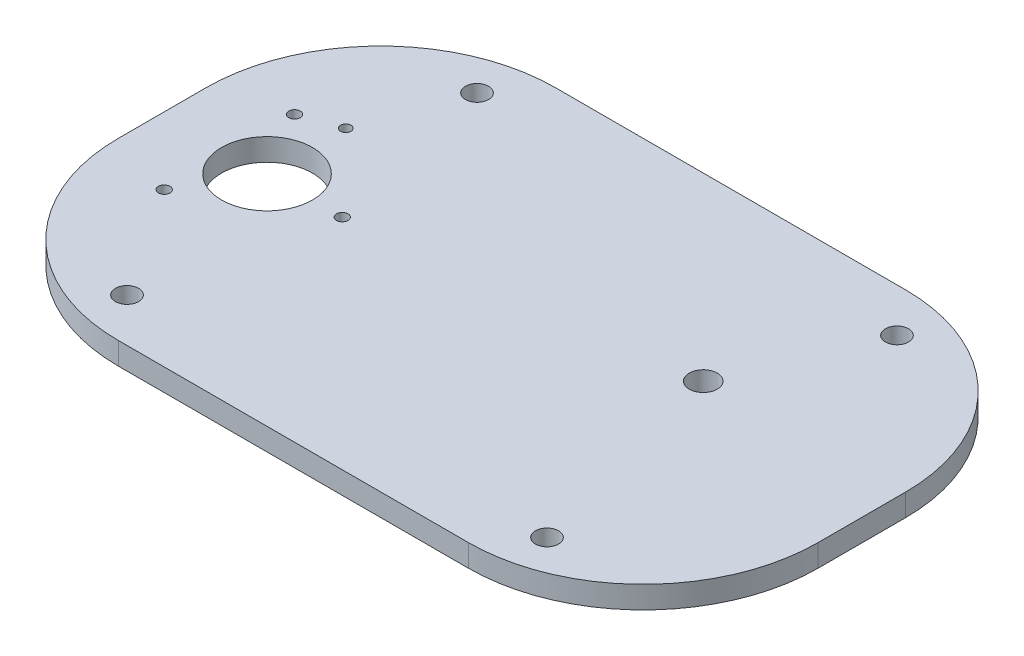
ISO-10303-21;
HEADER;
FILE_DESCRIPTION(('STEP AP214'),'2;1');
FILE_NAME('part.step','',(''),(''),'','','');
FILE_SCHEMA(('AUTOMOTIVE_DESIGN { 1 0 10303 214 1 1 1 1 }'));
ENDSEC;
DATA;
#1=APPLICATION_CONTEXT('core data for automotive mechanical design processes');
#2=APPLICATION_PROTOCOL_DEFINITION('international standard','automotive_design',2000,#1);
#3=PRODUCT_CONTEXT('',#1,'mechanical');
#4=PRODUCT('Part','Part','',(#3));
#5=PRODUCT_RELATED_PRODUCT_CATEGORY('part','',(#4));
#6=PRODUCT_DEFINITION_FORMATION('','',#4);
#7=PRODUCT_DEFINITION_CONTEXT('part definition',#1,'design');
#8=PRODUCT_DEFINITION('design','',#6,#7);
#9=PRODUCT_DEFINITION_SHAPE('','',#8);
#10=(LENGTH_UNIT() NAMED_UNIT(*) SI_UNIT(.MILLI.,.METRE.));
#11=(NAMED_UNIT(*) PLANE_ANGLE_UNIT() SI_UNIT($,.RADIAN.));
#12=(NAMED_UNIT(*) SI_UNIT($,.STERADIAN.) SOLID_ANGLE_UNIT());
#13=UNCERTAINTY_MEASURE_WITH_UNIT(LENGTH_MEASURE(1.E-05),#10,'distance_accuracy_value','');
#14=(GEOMETRIC_REPRESENTATION_CONTEXT(3) GLOBAL_UNCERTAINTY_ASSIGNED_CONTEXT((#13)) GLOBAL_UNIT_ASSIGNED_CONTEXT((#10,
#11,#12)) REPRESENTATION_CONTEXT('',''));
#15=CARTESIAN_POINT('',(0.,0.,0.));
#16=DIRECTION('',(0.,0.,1.));
#17=DIRECTION('',(1.,0.,0.));
#18=AXIS2_PLACEMENT_3D('',#15,#16,#17);
#19=CARTESIAN_POINT('',(0.,6.35,62.5));
#20=DIRECTION('',(0.,0.,-1.));
#21=DIRECTION('',(-1.,0.,0.));
#22=AXIS2_PLACEMENT_3D('',#19,#20,#21);
#23=PLANE('',#22);
#24=DIRECTION('',(1.,0.,0.));
#25=VECTOR('',#24,1.);
#26=CARTESIAN_POINT('',(0.,0.,62.5));
#27=LINE('',#26,#25);
#28=CARTESIAN_POINT('',(-50.,0.,62.5));
#29=VERTEX_POINT('',#28);
#30=CARTESIAN_POINT('',(50.,0.,62.5));
#31=VERTEX_POINT('',#30);
#32=EDGE_CURVE('E143',#29,#31,#27,.T.);
#33=ORIENTED_EDGE('',*,*,#32,.T.);
#34=DIRECTION('',(0.,-1.,0.));
#35=VECTOR('',#34,1.);
#36=CARTESIAN_POINT('',(50.,6.35,62.5));
#37=LINE('',#36,#35);
#38=CARTESIAN_POINT('',(50.,6.35,62.5));
#39=VERTEX_POINT('',#38);
#40=EDGE_CURVE('E117',#31,#39,#37,.F.);
#41=ORIENTED_EDGE('',*,*,#40,.T.);
#42=DIRECTION('',(1.,0.,0.));
#43=VECTOR('',#42,1.);
#44=CARTESIAN_POINT('',(0.,6.35,62.5));
#45=LINE('',#44,#43);
#46=CARTESIAN_POINT('',(-50.,6.35,62.5));
#47=VERTEX_POINT('',#46);
#48=EDGE_CURVE('E180',#47,#39,#45,.T.);
#49=ORIENTED_EDGE('',*,*,#48,.F.);
#50=DIRECTION('',(0.,-1.,0.));
#51=VECTOR('',#50,1.);
#52=CARTESIAN_POINT('',(-50.,0.,62.5));
#53=LINE('',#52,#51);
#54=EDGE_CURVE('E123',#47,#29,#53,.T.);
#55=ORIENTED_EDGE('',*,*,#54,.T.);
#56=EDGE_LOOP('',(#33,#41,#49,#55));
#57=FACE_BOUND('',#56,.T.);
#58=ADVANCED_FACE('F45',(#57),#23,.F.);
#59=CARTESIAN_POINT('',(100.,6.35,0.));
#60=DIRECTION('',(-1.,0.,0.));
#61=DIRECTION('',(0.,0.,1.));
#62=AXIS2_PLACEMENT_3D('',#59,#60,#61);
#63=PLANE('',#62);
#64=DIRECTION('',(0.,0.,-1.));
#65=VECTOR('',#64,1.);
#66=CARTESIAN_POINT('',(100.,6.35,0.));
#67=LINE('',#66,#65);
#68=CARTESIAN_POINT('',(100.,6.35,12.5));
#69=VERTEX_POINT('',#68);
#70=CARTESIAN_POINT('',(100.,6.35,-12.5));
#71=VERTEX_POINT('',#70);
#72=EDGE_CURVE('E133',#69,#71,#67,.T.);
#73=ORIENTED_EDGE('',*,*,#72,.F.);
#74=DIRECTION('',(0.,-1.,0.));
#75=VECTOR('',#74,1.);
#76=CARTESIAN_POINT('',(100.,6.35,12.5));
#77=LINE('',#76,#75);
#78=CARTESIAN_POINT('',(100.,0.,12.5));
#79=VERTEX_POINT('',#78);
#80=EDGE_CURVE('E116',#69,#79,#77,.T.);
#81=ORIENTED_EDGE('',*,*,#80,.T.);
#82=DIRECTION('',(0.,0.,-1.));
#83=VECTOR('',#82,1.);
#84=CARTESIAN_POINT('',(100.,0.,0.));
#85=LINE('',#84,#83);
#86=CARTESIAN_POINT('',(100.,0.,-12.5));
#87=VERTEX_POINT('',#86);
#88=EDGE_CURVE('E130',#79,#87,#85,.T.);
#89=ORIENTED_EDGE('',*,*,#88,.T.);
#90=DIRECTION('',(0.,-1.,0.));
#91=VECTOR('',#90,1.);
#92=CARTESIAN_POINT('',(100.,6.35,-12.5));
#93=LINE('',#92,#91);
#94=EDGE_CURVE('E136',#87,#71,#93,.F.);
#95=ORIENTED_EDGE('',*,*,#94,.T.);
#96=EDGE_LOOP('',(#73,#81,#89,#95));
#97=FACE_BOUND('',#96,.T.);
#98=ADVANCED_FACE('F129',(#97),#63,.F.);
#99=CARTESIAN_POINT('',(0.,6.35,-62.5));
#100=DIRECTION('',(0.,0.,-1.));
#101=DIRECTION('',(-1.,0.,0.));
#102=AXIS2_PLACEMENT_3D('',#99,#100,#101);
#103=PLANE('',#102);
#104=DIRECTION('',(1.,0.,0.));
#105=VECTOR('',#104,1.);
#106=CARTESIAN_POINT('',(0.,6.35,-62.5));
#107=LINE('',#106,#105);
#108=CARTESIAN_POINT('',(-50.,6.35,-62.5));
#109=VERTEX_POINT('',#108);
#110=CARTESIAN_POINT('',(50.,6.35,-62.5));
#111=VERTEX_POINT('',#110);
#112=EDGE_CURVE('E239',#109,#111,#107,.T.);
#113=ORIENTED_EDGE('',*,*,#112,.T.);
#114=DIRECTION('',(0.,-1.,0.));
#115=VECTOR('',#114,1.);
#116=CARTESIAN_POINT('',(50.,0.,-62.5));
#117=LINE('',#116,#115);
#118=CARTESIAN_POINT('',(50.,0.,-62.5));
#119=VERTEX_POINT('',#118);
#120=EDGE_CURVE('E210',#111,#119,#117,.T.);
#121=ORIENTED_EDGE('',*,*,#120,.T.);
#122=DIRECTION('',(1.,0.,0.));
#123=VECTOR('',#122,1.);
#124=CARTESIAN_POINT('',(0.,0.,-62.5));
#125=LINE('',#124,#123);
#126=CARTESIAN_POINT('',(-50.,0.,-62.5));
#127=VERTEX_POINT('',#126);
#128=EDGE_CURVE('E142',#127,#119,#125,.T.);
#129=ORIENTED_EDGE('',*,*,#128,.F.);
#130=DIRECTION('',(0.,-1.,0.));
#131=VECTOR('',#130,1.);
#132=CARTESIAN_POINT('',(-50.,6.35,-62.5));
#133=LINE('',#132,#131);
#134=EDGE_CURVE('E207',#127,#109,#133,.F.);
#135=ORIENTED_EDGE('',*,*,#134,.T.);
#136=EDGE_LOOP('',(#113,#121,#129,#135));
#137=FACE_BOUND('',#136,.T.);
#138=ADVANCED_FACE('F329',(#137),#103,.T.);
#139=CARTESIAN_POINT('',(-70.,6.35,-22.5000000000003));
#140=DIRECTION('',(0.,-1.,0.));
#141=DIRECTION('',(0.,0.,-1.));
#142=AXIS2_PLACEMENT_3D('',#139,#140,#141);
#143=CYLINDRICAL_SURFACE('',#142,1.5);
#144=CARTESIAN_POINT('',(-70.,6.35,-22.5000000000003));
#145=DIRECTION('',(0.,1.,0.));
#146=DIRECTION('',(0.,0.,1.));
#147=AXIS2_PLACEMENT_3D('',#144,#145,#146);
#148=CIRCLE('',#147,1.5);
#149=CARTESIAN_POINT('',(-70.,6.35,-21.0000000000003));
#150=VERTEX_POINT('',#149);
#151=EDGE_CURVE('E217',#150,#150,#148,.T.);
#152=ORIENTED_EDGE('',*,*,#151,.T.);
#153=EDGE_LOOP('',(#152));
#154=FACE_BOUND('',#153,.T.);
#155=CARTESIAN_POINT('',(-70.,0.,-22.5000000000003));
#156=DIRECTION('',(0.,1.,0.));
#157=DIRECTION('',(0.,0.,1.));
#158=AXIS2_PLACEMENT_3D('',#155,#156,#157);
#159=CIRCLE('',#158,1.5);
#160=CARTESIAN_POINT('',(-70.,0.,-21.0000000000003));
#161=VERTEX_POINT('',#160);
#162=EDGE_CURVE('E172',#161,#161,#159,.T.);
#163=ORIENTED_EDGE('',*,*,#162,.F.);
#164=EDGE_LOOP('',(#163));
#165=FACE_BOUND('',#164,.T.);
#166=ADVANCED_FACE('F352',(#154,#165),#143,.F.);
#167=CARTESIAN_POINT('',(-80.7500000000001,6.35,18.6195461813697));
#168=DIRECTION('',(0.,-1.,0.));
#169=DIRECTION('',(0.,0.,-1.));
#170=AXIS2_PLACEMENT_3D('',#167,#168,#169);
#171=CYLINDRICAL_SURFACE('',#170,1.65000000000059);
#172=CARTESIAN_POINT('',(-80.7500000000001,6.35,18.6195461813697));
#173=DIRECTION('',(0.,1.,0.));
#174=DIRECTION('',(0.,0.,1.));
#175=AXIS2_PLACEMENT_3D('',#172,#173,#174);
#176=CIRCLE('',#175,1.65000000000059);
#177=CARTESIAN_POINT('',(-80.7500000000001,6.35,20.2695461813703));
#178=VERTEX_POINT('',#177);
#179=EDGE_CURVE('E220',#178,#178,#176,.T.);
#180=ORIENTED_EDGE('',*,*,#179,.T.);
#181=EDGE_LOOP('',(#180));
#182=FACE_BOUND('',#181,.T.);
#183=CARTESIAN_POINT('',(-80.7500000000001,0.,18.6195461813697));
#184=DIRECTION('',(0.,1.,0.));
#185=DIRECTION('',(0.,0.,1.));
#186=AXIS2_PLACEMENT_3D('',#183,#184,#185);
#187=CIRCLE('',#186,1.65000000000059);
#188=CARTESIAN_POINT('',(-80.7500000000001,0.,20.2695461813703));
#189=VERTEX_POINT('',#188);
#190=EDGE_CURVE('E168',#189,#189,#187,.T.);
#191=ORIENTED_EDGE('',*,*,#190,.F.);
#192=EDGE_LOOP('',(#191));
#193=FACE_BOUND('',#192,.T.);
#194=ADVANCED_FACE('F356',(#182,#193),#171,.F.);
#195=CARTESIAN_POINT('',(-80.75,6.35,-18.6195461813703));
#196=DIRECTION('',(0.,-1.,0.));
#197=DIRECTION('',(0.,0.,-1.));
#198=AXIS2_PLACEMENT_3D('',#195,#196,#197);
#199=CYLINDRICAL_SURFACE('',#198,1.65000000000059);
#200=CARTESIAN_POINT('',(-80.75,6.35,-18.6195461813703));
#201=DIRECTION('',(0.,1.,0.));
#202=DIRECTION('',(0.,0.,1.));
#203=AXIS2_PLACEMENT_3D('',#200,#201,#202);
#204=CIRCLE('',#203,1.65000000000059);
#205=CARTESIAN_POINT('',(-80.75,6.35,-16.9695461813697));
#206=VERTEX_POINT('',#205);
#207=EDGE_CURVE('E224',#206,#206,#204,.T.);
#208=ORIENTED_EDGE('',*,*,#207,.T.);
#209=EDGE_LOOP('',(#208));
#210=FACE_BOUND('',#209,.T.);
#211=CARTESIAN_POINT('',(-80.75,0.,-18.6195461813703));
#212=DIRECTION('',(0.,1.,0.));
#213=DIRECTION('',(0.,0.,1.));
#214=AXIS2_PLACEMENT_3D('',#211,#212,#213);
#215=CIRCLE('',#214,1.65000000000059);
#216=CARTESIAN_POINT('',(-80.75,0.,-16.9695461813697));
#217=VERTEX_POINT('',#216);
#218=EDGE_CURVE('E164',#217,#217,#215,.T.);
#219=ORIENTED_EDGE('',*,*,#218,.F.);
#220=EDGE_LOOP('',(#219));
#221=FACE_BOUND('',#220,.T.);
#222=ADVANCED_FACE('F369',(#210,#221),#199,.F.);
#223=CARTESIAN_POINT('',(-48.5000000000001,6.35,-2.33343359525923E-13));
#224=DIRECTION('',(0.,-1.,0.));
#225=DIRECTION('',(0.,0.,-1.));
#226=AXIS2_PLACEMENT_3D('',#223,#224,#225);
#227=CYLINDRICAL_SURFACE('',#226,1.65000000000001);
#228=CARTESIAN_POINT('',(-48.5000000000001,6.35,-2.33343359525923E-13));
#229=DIRECTION('',(0.,1.,0.));
#230=DIRECTION('',(0.,0.,1.));
#231=AXIS2_PLACEMENT_3D('',#228,#229,#230);
#232=CIRCLE('',#231,1.65000000000001);
#233=CARTESIAN_POINT('',(-48.5000000000001,6.35,1.64999999999977));
#234=VERTEX_POINT('',#233);
#235=EDGE_CURVE('E228',#234,#234,#232,.T.);
#236=ORIENTED_EDGE('',*,*,#235,.T.);
#237=EDGE_LOOP('',(#236));
#238=FACE_BOUND('',#237,.T.);
#239=CARTESIAN_POINT('',(-48.5000000000001,0.,-2.33343359525923E-13));
#240=DIRECTION('',(0.,1.,0.));
#241=DIRECTION('',(0.,0.,1.));
#242=AXIS2_PLACEMENT_3D('',#239,#240,#241);
#243=CIRCLE('',#242,1.65000000000001);
#244=CARTESIAN_POINT('',(-48.5000000000001,0.,1.64999999999977));
#245=VERTEX_POINT('',#244);
#246=EDGE_CURVE('E160',#245,#245,#243,.T.);
#247=ORIENTED_EDGE('',*,*,#246,.F.);
#248=EDGE_LOOP('',(#247));
#249=FACE_BOUND('',#248,.T.);
#250=ADVANCED_FACE('F365',(#238,#249),#227,.F.);
#251=CARTESIAN_POINT('',(-70.0000000000001,6.35,-2.58406644306836E-13));
#252=DIRECTION('',(0.,-1.,0.));
#253=DIRECTION('',(0.,0.,-1.));
#254=AXIS2_PLACEMENT_3D('',#251,#252,#253);
#255=CYLINDRICAL_SURFACE('',#254,13.);
#256=CARTESIAN_POINT('',(-70.0000000000001,6.35,-2.58406644306836E-13));
#257=DIRECTION('',(0.,1.,0.));
#258=DIRECTION('',(0.,0.,1.));
#259=AXIS2_PLACEMENT_3D('',#256,#257,#258);
#260=CIRCLE('',#259,13.);
#261=CARTESIAN_POINT('',(-70.0000000000001,6.35,12.9999999999997));
#262=VERTEX_POINT('',#261);
#263=EDGE_CURVE('E232',#262,#262,#260,.T.);
#264=ORIENTED_EDGE('',*,*,#263,.T.);
#265=EDGE_LOOP('',(#264));
#266=FACE_BOUND('',#265,.T.);
#267=CARTESIAN_POINT('',(-70.0000000000001,0.,-2.58406644306836E-13));
#268=DIRECTION('',(0.,1.,0.));
#269=DIRECTION('',(0.,0.,1.));
#270=AXIS2_PLACEMENT_3D('',#267,#268,#269);
#271=CIRCLE('',#270,13.);
#272=CARTESIAN_POINT('',(-70.0000000000001,0.,12.9999999999997));
#273=VERTEX_POINT('',#272);
#274=EDGE_CURVE('E156',#273,#273,#271,.T.);
#275=ORIENTED_EDGE('',*,*,#274,.F.);
#276=EDGE_LOOP('',(#275));
#277=FACE_BOUND('',#276,.T.);
#278=ADVANCED_FACE('F362',(#266,#277),#255,.F.);
#279=CARTESIAN_POINT('',(-100.,6.35,0.));
#280=DIRECTION('',(-1.,0.,0.));
#281=DIRECTION('',(0.,0.,1.));
#282=AXIS2_PLACEMENT_3D('',#279,#280,#281);
#283=PLANE('',#282);
#284=DIRECTION('',(0.,0.,-1.));
#285=VECTOR('',#284,1.);
#286=CARTESIAN_POINT('',(-100.,6.35,0.));
#287=LINE('',#286,#285);
#288=CARTESIAN_POINT('',(-100.,6.35,12.5));
#289=VERTEX_POINT('',#288);
#290=CARTESIAN_POINT('',(-100.,6.35,-12.5));
#291=VERTEX_POINT('',#290);
#292=EDGE_CURVE('E236',#289,#291,#287,.T.);
#293=ORIENTED_EDGE('',*,*,#292,.T.);
#294=DIRECTION('',(0.,-1.,0.));
#295=VECTOR('',#294,1.);
#296=CARTESIAN_POINT('',(-100.,6.35,-12.5));
#297=LINE('',#296,#295);
#298=CARTESIAN_POINT('',(-100.,0.,-12.5));
#299=VERTEX_POINT('',#298);
#300=EDGE_CURVE('E11',#291,#299,#297,.T.);
#301=ORIENTED_EDGE('',*,*,#300,.T.);
#302=DIRECTION('',(0.,0.,-1.));
#303=VECTOR('',#302,1.);
#304=CARTESIAN_POINT('',(-100.,0.,0.));
#305=LINE('',#304,#303);
#306=CARTESIAN_POINT('',(-100.,0.,12.5));
#307=VERTEX_POINT('',#306);
#308=EDGE_CURVE('E147',#307,#299,#305,.T.);
#309=ORIENTED_EDGE('',*,*,#308,.F.);
#310=DIRECTION('',(0.,-1.,0.));
#311=VECTOR('',#310,1.);
#312=CARTESIAN_POINT('',(-100.,6.35,12.5));
#313=LINE('',#312,#311);
#314=EDGE_CURVE('E54',#307,#289,#313,.F.);
#315=ORIENTED_EDGE('',*,*,#314,.T.);
#316=EDGE_LOOP('',(#293,#301,#309,#315));
#317=FACE_BOUND('',#316,.T.);
#318=ADVANCED_FACE('F310',(#317),#283,.T.);
#319=CARTESIAN_POINT('',(43.6438763198442,6.35,-11.0000000000004));
#320=DIRECTION('',(0.,-1.,0.));
#321=DIRECTION('',(0.,0.,-1.));
#322=AXIS2_PLACEMENT_3D('',#319,#320,#321);
#323=CYLINDRICAL_SURFACE('',#322,4.00000000000003);
#324=CARTESIAN_POINT('',(43.6438763198442,6.35,-11.0000000000004));
#325=DIRECTION('',(0.,1.,0.));
#326=DIRECTION('',(0.,0.,1.));
#327=AXIS2_PLACEMENT_3D('',#324,#325,#326);
#328=CIRCLE('',#327,4.00000000000003);
#329=CARTESIAN_POINT('',(43.6438763198442,6.35,-7.00000000000041));
#330=VERTEX_POINT('',#329);
#331=EDGE_CURVE('E182',#330,#330,#328,.T.);
#332=ORIENTED_EDGE('',*,*,#331,.T.);
#333=EDGE_LOOP('',(#332));
#334=FACE_BOUND('',#333,.T.);
#335=CARTESIAN_POINT('',(43.6438763198442,0.,-11.0000000000004));
#336=DIRECTION('',(0.,1.,0.));
#337=DIRECTION('',(0.,0.,1.));
#338=AXIS2_PLACEMENT_3D('',#335,#336,#337);
#339=CIRCLE('',#338,4.00000000000003);
#340=CARTESIAN_POINT('',(43.6438763198442,0.,-7.00000000000041));
#341=VERTEX_POINT('',#340);
#342=EDGE_CURVE('E176',#341,#341,#339,.T.);
#343=ORIENTED_EDGE('',*,*,#342,.F.);
#344=EDGE_LOOP('',(#343));
#345=FACE_BOUND('',#344,.T.);
#346=ADVANCED_FACE('F288',(#334,#345),#323,.F.);
#347=CARTESIAN_POINT('',(0.,6.35,0.));
#348=DIRECTION('',(0.,1.,0.));
#349=DIRECTION('',(0.,0.,1.));
#350=AXIS2_PLACEMENT_3D('',#347,#348,#349);
#351=PLANE('',#350);
#352=CARTESIAN_POINT('',(60.,6.35,-50.));
#353=DIRECTION('',(0.,1.,0.));
#354=DIRECTION('',(0.,0.,1.));
#355=AXIS2_PLACEMENT_3D('',#352,#353,#354);
#356=CIRCLE('',#355,3.3);
#357=CARTESIAN_POINT('',(60.,6.35,-46.7));
#358=VERTEX_POINT('',#357);
#359=EDGE_CURVE('E277',#358,#358,#356,.T.);
#360=ORIENTED_EDGE('',*,*,#359,.F.);
#361=EDGE_LOOP('',(#360));
#362=FACE_BOUND('',#361,.T.);
#363=CARTESIAN_POINT('',(-60.,6.35,50.));
#364=DIRECTION('',(0.,1.,0.));
#365=DIRECTION('',(0.,0.,1.));
#366=AXIS2_PLACEMENT_3D('',#363,#364,#365);
#367=CIRCLE('',#366,3.3);
#368=CARTESIAN_POINT('',(-60.,6.35,53.3));
#369=VERTEX_POINT('',#368);
#370=EDGE_CURVE('E269',#369,#369,#367,.T.);
#371=ORIENTED_EDGE('',*,*,#370,.F.);
#372=EDGE_LOOP('',(#371));
#373=FACE_BOUND('',#372,.T.);
#374=CARTESIAN_POINT('',(-60.,6.35,-50.));
#375=DIRECTION('',(0.,1.,0.));
#376=DIRECTION('',(0.,0.,1.));
#377=AXIS2_PLACEMENT_3D('',#374,#375,#376);
#378=CIRCLE('',#377,3.3);
#379=CARTESIAN_POINT('',(-60.,6.35,-46.7));
#380=VERTEX_POINT('',#379);
#381=EDGE_CURVE('E261',#380,#380,#378,.T.);
#382=ORIENTED_EDGE('',*,*,#381,.F.);
#383=EDGE_LOOP('',(#382));
#384=FACE_BOUND('',#383,.T.);
#385=CARTESIAN_POINT('',(60.,6.35,50.));
#386=DIRECTION('',(0.,1.,0.));
#387=DIRECTION('',(0.,0.,1.));
#388=AXIS2_PLACEMENT_3D('',#385,#386,#387);
#389=CIRCLE('',#388,3.3);
#390=CARTESIAN_POINT('',(60.,6.35,53.3));
#391=VERTEX_POINT('',#390);
#392=EDGE_CURVE('E253',#391,#391,#389,.T.);
#393=ORIENTED_EDGE('',*,*,#392,.F.);
#394=EDGE_LOOP('',(#393));
#395=FACE_BOUND('',#394,.T.);
#396=ORIENTED_EDGE('',*,*,#48,.T.);
#397=CARTESIAN_POINT('',(50.,6.35,12.5));
#398=DIRECTION('',(0.,1.,0.));
#399=DIRECTION('',(0.,0.,1.));
#400=AXIS2_PLACEMENT_3D('',#397,#398,#399);
#401=CIRCLE('',#400,50.);
#402=EDGE_CURVE('E204',#39,#69,#401,.T.);
#403=ORIENTED_EDGE('',*,*,#402,.T.);
#404=ORIENTED_EDGE('',*,*,#72,.T.);
#405=CARTESIAN_POINT('',(50.,6.35,-12.5));
#406=DIRECTION('',(0.,1.,0.));
#407=DIRECTION('',(0.,0.,1.));
#408=AXIS2_PLACEMENT_3D('',#405,#406,#407);
#409=CIRCLE('',#408,50.);
#410=EDGE_CURVE('E201',#71,#111,#409,.T.);
#411=ORIENTED_EDGE('',*,*,#410,.T.);
#412=ORIENTED_EDGE('',*,*,#112,.F.);
#413=CARTESIAN_POINT('',(-50.,6.35,-12.5));
#414=DIRECTION('',(0.,1.,0.));
#415=DIRECTION('',(0.,0.,1.));
#416=AXIS2_PLACEMENT_3D('',#413,#414,#415);
#417=CIRCLE('',#416,50.);
#418=EDGE_CURVE('E61',#109,#291,#417,.T.);
#419=ORIENTED_EDGE('',*,*,#418,.T.);
#420=ORIENTED_EDGE('',*,*,#292,.F.);
#421=CARTESIAN_POINT('',(-50.,6.35,12.5));
#422=DIRECTION('',(0.,1.,0.));
#423=DIRECTION('',(0.,0.,1.));
#424=AXIS2_PLACEMENT_3D('',#421,#422,#423);
#425=CIRCLE('',#424,50.);
#426=EDGE_CURVE('E196',#289,#47,#425,.T.);
#427=ORIENTED_EDGE('',*,*,#426,.T.);
#428=EDGE_LOOP('',(#396,#403,#404,#411,#412,#419,#420,#427));
#429=FACE_BOUND('',#428,.T.);
#430=ORIENTED_EDGE('',*,*,#263,.F.);
#431=EDGE_LOOP('',(#430));
#432=FACE_BOUND('',#431,.T.);
#433=ORIENTED_EDGE('',*,*,#235,.F.);
#434=EDGE_LOOP('',(#433));
#435=FACE_BOUND('',#434,.T.);
#436=ORIENTED_EDGE('',*,*,#207,.F.);
#437=EDGE_LOOP('',(#436));
#438=FACE_BOUND('',#437,.T.);
#439=ORIENTED_EDGE('',*,*,#179,.F.);
#440=EDGE_LOOP('',(#439));
#441=FACE_BOUND('',#440,.T.);
#442=ORIENTED_EDGE('',*,*,#151,.F.);
#443=EDGE_LOOP('',(#442));
#444=FACE_BOUND('',#443,.T.);
#445=ORIENTED_EDGE('',*,*,#331,.F.);
#446=EDGE_LOOP('',(#445));
#447=FACE_BOUND('',#446,.T.);
#448=ADVANCED_FACE('F285',(#362,#373,#384,#395,#429,#432,#435,#438,#441,#444,#447),#351,.T.);
#449=CARTESIAN_POINT('',(0.,0.,0.));
#450=DIRECTION('',(0.,1.,0.));
#451=DIRECTION('',(0.,0.,1.));
#452=AXIS2_PLACEMENT_3D('',#449,#450,#451);
#453=PLANE('',#452);
#454=CARTESIAN_POINT('',(60.,0.,-50.));
#455=DIRECTION('',(0.,1.,0.));
#456=DIRECTION('',(0.,0.,1.));
#457=AXIS2_PLACEMENT_3D('',#454,#455,#456);
#458=CIRCLE('',#457,3.3);
#459=CARTESIAN_POINT('',(60.,0.,-46.7));
#460=VERTEX_POINT('',#459);
#461=EDGE_CURVE('E273',#460,#460,#458,.T.);
#462=ORIENTED_EDGE('',*,*,#461,.T.);
#463=EDGE_LOOP('',(#462));
#464=FACE_BOUND('',#463,.T.);
#465=CARTESIAN_POINT('',(-60.,0.,50.));
#466=DIRECTION('',(0.,1.,0.));
#467=DIRECTION('',(0.,0.,1.));
#468=AXIS2_PLACEMENT_3D('',#465,#466,#467);
#469=CIRCLE('',#468,3.3);
#470=CARTESIAN_POINT('',(-60.,0.,53.3));
#471=VERTEX_POINT('',#470);
#472=EDGE_CURVE('E265',#471,#471,#469,.T.);
#473=ORIENTED_EDGE('',*,*,#472,.T.);
#474=EDGE_LOOP('',(#473));
#475=FACE_BOUND('',#474,.T.);
#476=CARTESIAN_POINT('',(-60.,0.,-50.));
#477=DIRECTION('',(0.,1.,0.));
#478=DIRECTION('',(0.,0.,1.));
#479=AXIS2_PLACEMENT_3D('',#476,#477,#478);
#480=CIRCLE('',#479,3.3);
#481=CARTESIAN_POINT('',(-60.,0.,-46.7));
#482=VERTEX_POINT('',#481);
#483=EDGE_CURVE('E257',#482,#482,#480,.T.);
#484=ORIENTED_EDGE('',*,*,#483,.T.);
#485=EDGE_LOOP('',(#484));
#486=FACE_BOUND('',#485,.T.);
#487=CARTESIAN_POINT('',(60.,0.,50.));
#488=DIRECTION('',(0.,1.,0.));
#489=DIRECTION('',(0.,0.,1.));
#490=AXIS2_PLACEMENT_3D('',#487,#488,#489);
#491=CIRCLE('',#490,3.3);
#492=CARTESIAN_POINT('',(60.,0.,53.3));
#493=VERTEX_POINT('',#492);
#494=EDGE_CURVE('E149',#493,#493,#491,.T.);
#495=ORIENTED_EDGE('',*,*,#494,.T.);
#496=EDGE_LOOP('',(#495));
#497=FACE_BOUND('',#496,.T.);
#498=ORIENTED_EDGE('',*,*,#88,.F.);
#499=CARTESIAN_POINT('',(50.,0.,12.5));
#500=DIRECTION('',(0.,1.,0.));
#501=DIRECTION('',(0.,0.,1.));
#502=AXIS2_PLACEMENT_3D('',#499,#500,#501);
#503=CIRCLE('',#502,50.);
#504=EDGE_CURVE('E112',#79,#31,#503,.F.);
#505=ORIENTED_EDGE('',*,*,#504,.T.);
#506=ORIENTED_EDGE('',*,*,#32,.F.);
#507=CARTESIAN_POINT('',(-50.,0.,12.5));
#508=DIRECTION('',(0.,1.,0.));
#509=DIRECTION('',(0.,0.,1.));
#510=AXIS2_PLACEMENT_3D('',#507,#508,#509);
#511=CIRCLE('',#510,50.);
#512=EDGE_CURVE('E135',#29,#307,#511,.F.);
#513=ORIENTED_EDGE('',*,*,#512,.T.);
#514=ORIENTED_EDGE('',*,*,#308,.T.);
#515=CARTESIAN_POINT('',(-50.,0.,-12.5));
#516=DIRECTION('',(0.,1.,0.));
#517=DIRECTION('',(0.,0.,1.));
#518=AXIS2_PLACEMENT_3D('',#515,#516,#517);
#519=CIRCLE('',#518,50.);
#520=EDGE_CURVE('E186',#299,#127,#519,.F.);
#521=ORIENTED_EDGE('',*,*,#520,.T.);
#522=ORIENTED_EDGE('',*,*,#128,.T.);
#523=CARTESIAN_POINT('',(50.,0.,-12.5));
#524=DIRECTION('',(0.,1.,0.));
#525=DIRECTION('',(0.,0.,1.));
#526=AXIS2_PLACEMENT_3D('',#523,#524,#525);
#527=CIRCLE('',#526,50.);
#528=EDGE_CURVE('E124',#119,#87,#527,.F.);
#529=ORIENTED_EDGE('',*,*,#528,.T.);
#530=EDGE_LOOP('',(#498,#505,#506,#513,#514,#521,#522,#529));
#531=FACE_BOUND('',#530,.T.);
#532=ORIENTED_EDGE('',*,*,#274,.T.);
#533=EDGE_LOOP('',(#532));
#534=FACE_BOUND('',#533,.T.);
#535=ORIENTED_EDGE('',*,*,#246,.T.);
#536=EDGE_LOOP('',(#535));
#537=FACE_BOUND('',#536,.T.);
#538=ORIENTED_EDGE('',*,*,#218,.T.);
#539=EDGE_LOOP('',(#538));
#540=FACE_BOUND('',#539,.T.);
#541=ORIENTED_EDGE('',*,*,#190,.T.);
#542=EDGE_LOOP('',(#541));
#543=FACE_BOUND('',#542,.T.);
#544=ORIENTED_EDGE('',*,*,#162,.T.);
#545=EDGE_LOOP('',(#544));
#546=FACE_BOUND('',#545,.T.);
#547=ORIENTED_EDGE('',*,*,#342,.T.);
#548=EDGE_LOOP('',(#547));
#549=FACE_BOUND('',#548,.T.);
#550=ADVANCED_FACE('F138',(#464,#475,#486,#497,#531,#534,#537,#540,#543,#546,#549),#453,.F.);
#551=CARTESIAN_POINT('',(50.,6.35,12.5));
#552=DIRECTION('',(0.,-1.,0.));
#553=DIRECTION('',(0.,0.,-1.));
#554=AXIS2_PLACEMENT_3D('',#551,#552,#553);
#555=CYLINDRICAL_SURFACE('',#554,50.);
#556=ORIENTED_EDGE('',*,*,#402,.F.);
#557=ORIENTED_EDGE('',*,*,#40,.F.);
#558=ORIENTED_EDGE('',*,*,#504,.F.);
#559=ORIENTED_EDGE('',*,*,#80,.F.);
#560=EDGE_LOOP('',(#556,#557,#558,#559));
#561=FACE_BOUND('',#560,.T.);
#562=ADVANCED_FACE('F115',(#561),#555,.T.);
#563=CARTESIAN_POINT('',(50.,6.35,-12.5));
#564=DIRECTION('',(0.,1.,0.));
#565=DIRECTION('',(0.,0.,1.));
#566=AXIS2_PLACEMENT_3D('',#563,#564,#565);
#567=CYLINDRICAL_SURFACE('',#566,50.);
#568=ORIENTED_EDGE('',*,*,#410,.F.);
#569=ORIENTED_EDGE('',*,*,#94,.F.);
#570=ORIENTED_EDGE('',*,*,#528,.F.);
#571=ORIENTED_EDGE('',*,*,#120,.F.);
#572=EDGE_LOOP('',(#568,#569,#570,#571));
#573=FACE_BOUND('',#572,.T.);
#574=ADVANCED_FACE('F320',(#573),#567,.T.);
#575=CARTESIAN_POINT('',(-50.,6.35,-12.5));
#576=DIRECTION('',(0.,-1.,0.));
#577=DIRECTION('',(0.,0.,-1.));
#578=AXIS2_PLACEMENT_3D('',#575,#576,#577);
#579=CYLINDRICAL_SURFACE('',#578,50.);
#580=ORIENTED_EDGE('',*,*,#418,.F.);
#581=ORIENTED_EDGE('',*,*,#134,.F.);
#582=ORIENTED_EDGE('',*,*,#520,.F.);
#583=ORIENTED_EDGE('',*,*,#300,.F.);
#584=EDGE_LOOP('',(#580,#581,#582,#583));
#585=FACE_BOUND('',#584,.T.);
#586=ADVANCED_FACE('F334',(#585),#579,.T.);
#587=CARTESIAN_POINT('',(-50.,6.35,12.5));
#588=DIRECTION('',(0.,1.,0.));
#589=DIRECTION('',(0.,0.,1.));
#590=AXIS2_PLACEMENT_3D('',#587,#588,#589);
#591=CYLINDRICAL_SURFACE('',#590,50.);
#592=ORIENTED_EDGE('',*,*,#426,.F.);
#593=ORIENTED_EDGE('',*,*,#314,.F.);
#594=ORIENTED_EDGE('',*,*,#512,.F.);
#595=ORIENTED_EDGE('',*,*,#54,.F.);
#596=EDGE_LOOP('',(#592,#593,#594,#595));
#597=FACE_BOUND('',#596,.T.);
#598=ADVANCED_FACE('F47',(#597),#591,.T.);
#599=CARTESIAN_POINT('',(60.,6.35,50.));
#600=DIRECTION('',(0.,1.,0.));
#601=DIRECTION('',(0.,0.,1.));
#602=AXIS2_PLACEMENT_3D('',#599,#600,#601);
#603=CYLINDRICAL_SURFACE('',#602,3.3);
#604=ORIENTED_EDGE('',*,*,#392,.T.);
#605=EDGE_LOOP('',(#604));
#606=FACE_BOUND('',#605,.T.);
#607=ORIENTED_EDGE('',*,*,#494,.F.);
#608=EDGE_LOOP('',(#607));
#609=FACE_BOUND('',#608,.T.);
#610=ADVANCED_FACE('F341',(#606,#609),#603,.F.);
#611=CARTESIAN_POINT('',(-60.,6.35,-50.));
#612=DIRECTION('',(0.,1.,0.));
#613=DIRECTION('',(0.,0.,1.));
#614=AXIS2_PLACEMENT_3D('',#611,#612,#613);
#615=CYLINDRICAL_SURFACE('',#614,3.3);
#616=ORIENTED_EDGE('',*,*,#381,.T.);
#617=EDGE_LOOP('',(#616));
#618=FACE_BOUND('',#617,.T.);
#619=ORIENTED_EDGE('',*,*,#483,.F.);
#620=EDGE_LOOP('',(#619));
#621=FACE_BOUND('',#620,.T.);
#622=ADVANCED_FACE('F423',(#618,#621),#615,.F.);
#623=CARTESIAN_POINT('',(-60.,6.35,50.));
#624=DIRECTION('',(0.,1.,0.));
#625=DIRECTION('',(0.,0.,1.));
#626=AXIS2_PLACEMENT_3D('',#623,#624,#625);
#627=CYLINDRICAL_SURFACE('',#626,3.3);
#628=ORIENTED_EDGE('',*,*,#370,.T.);
#629=EDGE_LOOP('',(#628));
#630=FACE_BOUND('',#629,.T.);
#631=ORIENTED_EDGE('',*,*,#472,.F.);
#632=EDGE_LOOP('',(#631));
#633=FACE_BOUND('',#632,.T.);
#634=ADVANCED_FACE('F420',(#630,#633),#627,.F.);
#635=CARTESIAN_POINT('',(60.,6.35,-50.));
#636=DIRECTION('',(0.,1.,0.));
#637=DIRECTION('',(0.,0.,1.));
#638=AXIS2_PLACEMENT_3D('',#635,#636,#637);
#639=CYLINDRICAL_SURFACE('',#638,3.3);
#640=ORIENTED_EDGE('',*,*,#359,.T.);
#641=EDGE_LOOP('',(#640));
#642=FACE_BOUND('',#641,.T.);
#643=ORIENTED_EDGE('',*,*,#461,.F.);
#644=EDGE_LOOP('',(#643));
#645=FACE_BOUND('',#644,.T.);
#646=ADVANCED_FACE('F282',(#642,#645),#639,.F.);
#647=CLOSED_SHELL('',(#58,#98,#138,#166,#194,#222,#250,#278,#318,#346,#448,#550,#562,#574,#586,
#598,#610,#622,#634,#646));
#648=MANIFOLD_SOLID_BREP('B2',#647);
#649=ADVANCED_BREP_SHAPE_REPRESENTATION('',(#18,#648),#14);
#650=SHAPE_DEFINITION_REPRESENTATION(#9,#649);
ENDSEC;
END-ISO-10303-21;
